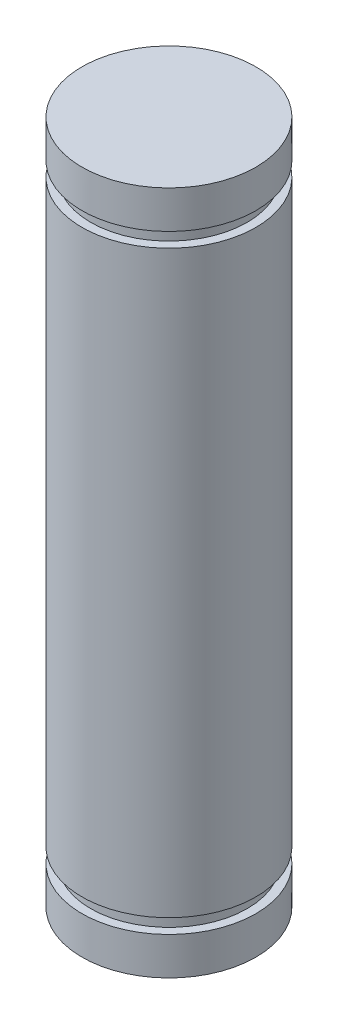
ISO-10303-21;
HEADER;
FILE_DESCRIPTION(('STEP AP214'),'2;1');
FILE_NAME('part.step','',(''),(''),'','','');
FILE_SCHEMA(('AUTOMOTIVE_DESIGN { 1 0 10303 214 1 1 1 1 }'));
ENDSEC;
DATA;
#1=APPLICATION_CONTEXT('core data for automotive mechanical design processes');
#2=APPLICATION_PROTOCOL_DEFINITION('international standard','automotive_design',2000,#1);
#3=PRODUCT_CONTEXT('',#1,'mechanical');
#4=PRODUCT('Part','Part','',(#3));
#5=PRODUCT_RELATED_PRODUCT_CATEGORY('part','',(#4));
#6=PRODUCT_DEFINITION_FORMATION('','',#4);
#7=PRODUCT_DEFINITION_CONTEXT('part definition',#1,'design');
#8=PRODUCT_DEFINITION('design','',#6,#7);
#9=PRODUCT_DEFINITION_SHAPE('','',#8);
#10=(LENGTH_UNIT() NAMED_UNIT(*) SI_UNIT(.MILLI.,.METRE.));
#11=(NAMED_UNIT(*) PLANE_ANGLE_UNIT() SI_UNIT($,.RADIAN.));
#12=(NAMED_UNIT(*) SI_UNIT($,.STERADIAN.) SOLID_ANGLE_UNIT());
#13=UNCERTAINTY_MEASURE_WITH_UNIT(LENGTH_MEASURE(1.E-05),#10,'distance_accuracy_value','');
#14=(GEOMETRIC_REPRESENTATION_CONTEXT(3) GLOBAL_UNCERTAINTY_ASSIGNED_CONTEXT((#13)) GLOBAL_UNIT_ASSIGNED_CONTEXT((#10,
#11,#12)) REPRESENTATION_CONTEXT('',''));
#15=CARTESIAN_POINT('',(0.,0.,0.));
#16=DIRECTION('',(0.,0.,1.));
#17=DIRECTION('',(1.,0.,0.));
#18=AXIS2_PLACEMENT_3D('',#15,#16,#17);
#19=CARTESIAN_POINT('',(0.,-11.8,0.));
#20=DIRECTION('',(0.,-1.,0.));
#21=DIRECTION('',(1.,0.,0.));
#22=AXIS2_PLACEMENT_3D('',#19,#20,#21);
#23=CYLINDRICAL_SURFACE('',#22,3.);
#24=CARTESIAN_POINT('',(0.,11.8,0.));
#25=DIRECTION('',(0.,-1.,0.));
#26=DIRECTION('',(1.,0.,0.));
#27=AXIS2_PLACEMENT_3D('',#24,#25,#26);
#28=CIRCLE('',#27,3.);
#29=CARTESIAN_POINT('',(3.,11.8,0.));
#30=VERTEX_POINT('',#29);
#31=EDGE_CURVE('E42',#30,#30,#28,.T.);
#32=ORIENTED_EDGE('',*,*,#31,.T.);
#33=EDGE_LOOP('',(#32));
#34=FACE_BOUND('',#33,.T.);
#35=CARTESIAN_POINT('',(0.,10.5,0.));
#36=DIRECTION('',(0.,-1.,0.));
#37=DIRECTION('',(0.,0.,-1.));
#38=AXIS2_PLACEMENT_3D('',#35,#36,#37);
#39=CIRCLE('',#38,2.99999999999999);
#40=CARTESIAN_POINT('',(0.,10.5,-2.99999999999999));
#41=VERTEX_POINT('',#40);
#42=EDGE_CURVE('E67',#41,#41,#39,.T.);
#43=ORIENTED_EDGE('',*,*,#42,.F.);
#44=EDGE_LOOP('',(#43));
#45=FACE_BOUND('',#44,.T.);
#46=ADVANCED_FACE('F40',(#34,#45),#23,.T.);
#47=CARTESIAN_POINT('',(-3.,11.8,0.));
#48=DIRECTION('',(0.,-1.,0.));
#49=DIRECTION('',(1.,0.,0.));
#50=AXIS2_PLACEMENT_3D('',#47,#48,#49);
#51=PLANE('',#50);
#52=ORIENTED_EDGE('',*,*,#31,.F.);
#53=EDGE_LOOP('',(#52));
#54=FACE_BOUND('',#53,.T.);
#55=ADVANCED_FACE('F39',(#54),#51,.F.);
#56=CARTESIAN_POINT('',(0.,0.,0.));
#57=DIRECTION('',(0.,-1.,0.));
#58=DIRECTION('',(0.,0.,-1.));
#59=AXIS2_PLACEMENT_3D('',#56,#57,#58);
#60=CYLINDRICAL_SURFACE('',#59,2.7);
#61=CARTESIAN_POINT('',(0.,10.5,0.));
#62=DIRECTION('',(0.,-1.,0.));
#63=DIRECTION('',(0.,0.,-1.));
#64=AXIS2_PLACEMENT_3D('',#61,#62,#63);
#65=CIRCLE('',#64,2.7);
#66=CARTESIAN_POINT('',(0.,10.5,-2.7));
#67=VERTEX_POINT('',#66);
#68=EDGE_CURVE('E59',#67,#67,#65,.T.);
#69=ORIENTED_EDGE('',*,*,#68,.T.);
#70=EDGE_LOOP('',(#69));
#71=FACE_BOUND('',#70,.T.);
#72=CARTESIAN_POINT('',(0.,10.,0.));
#73=DIRECTION('',(0.,-1.,0.));
#74=DIRECTION('',(0.,0.,-1.));
#75=AXIS2_PLACEMENT_3D('',#72,#73,#74);
#76=CIRCLE('',#75,2.7);
#77=CARTESIAN_POINT('',(0.,10.,-2.7));
#78=VERTEX_POINT('',#77);
#79=EDGE_CURVE('E48',#78,#78,#76,.T.);
#80=ORIENTED_EDGE('',*,*,#79,.F.);
#81=EDGE_LOOP('',(#80));
#82=FACE_BOUND('',#81,.T.);
#83=ADVANCED_FACE('F79',(#71,#82),#60,.T.);
#84=CARTESIAN_POINT('',(-2.7,10.,0.));
#85=DIRECTION('',(0.,1.,0.));
#86=DIRECTION('',(0.,0.,1.));
#87=AXIS2_PLACEMENT_3D('',#84,#85,#86);
#88=PLANE('',#87);
#89=ORIENTED_EDGE('',*,*,#79,.T.);
#90=EDGE_LOOP('',(#89));
#91=FACE_BOUND('',#90,.T.);
#92=CARTESIAN_POINT('',(0.,10.,0.));
#93=DIRECTION('',(0.,-1.,0.));
#94=DIRECTION('',(0.,0.,-1.));
#95=AXIS2_PLACEMENT_3D('',#92,#93,#94);
#96=CIRCLE('',#95,2.99999999999999);
#97=CARTESIAN_POINT('',(0.,10.,-2.99999999999999));
#98=VERTEX_POINT('',#97);
#99=EDGE_CURVE('E55',#98,#98,#96,.T.);
#100=ORIENTED_EDGE('',*,*,#99,.F.);
#101=EDGE_LOOP('',(#100));
#102=FACE_BOUND('',#101,.T.);
#103=ADVANCED_FACE('F81',(#91,#102),#88,.T.);
#104=CARTESIAN_POINT('',(-2.99999999999999,10.5,0.));
#105=DIRECTION('',(0.,-1.,0.));
#106=DIRECTION('',(0.,0.,-1.));
#107=AXIS2_PLACEMENT_3D('',#104,#105,#106);
#108=PLANE('',#107);
#109=ORIENTED_EDGE('',*,*,#42,.T.);
#110=EDGE_LOOP('',(#109));
#111=FACE_BOUND('',#110,.T.);
#112=ORIENTED_EDGE('',*,*,#68,.F.);
#113=EDGE_LOOP('',(#112));
#114=FACE_BOUND('',#113,.T.);
#115=ADVANCED_FACE('F78',(#111,#114),#108,.T.);
#116=CARTESIAN_POINT('',(0.,-10.,0.));
#117=DIRECTION('',(0.,-1.,0.));
#118=DIRECTION('',(0.,0.,-1.));
#119=AXIS2_PLACEMENT_3D('',#116,#117,#118);
#120=CIRCLE('',#119,2.99999999999999);
#121=CARTESIAN_POINT('',(0.,-10.,-2.99999999999999));
#122=VERTEX_POINT('',#121);
#123=EDGE_CURVE('E61',#122,#122,#120,.T.);
#124=ORIENTED_EDGE('',*,*,#123,.F.);
#125=EDGE_LOOP('',(#124));
#126=FACE_BOUND('',#125,.T.);
#127=ORIENTED_EDGE('',*,*,#99,.T.);
#128=EDGE_LOOP('',(#127));
#129=FACE_BOUND('',#128,.T.);
#130=ADVANCED_FACE('F84',(#126,#129),#23,.T.);
#131=CARTESIAN_POINT('',(-2.99999999999999,-10.5,0.));
#132=DIRECTION('',(0.,1.,0.));
#133=DIRECTION('',(0.,0.,1.));
#134=AXIS2_PLACEMENT_3D('',#131,#132,#133);
#135=PLANE('',#134);
#136=CARTESIAN_POINT('',(0.,-10.5,0.));
#137=DIRECTION('',(0.,-1.,0.));
#138=DIRECTION('',(0.,0.,-1.));
#139=AXIS2_PLACEMENT_3D('',#136,#137,#138);
#140=CIRCLE('',#139,2.7);
#141=CARTESIAN_POINT('',(0.,-10.5,-2.7));
#142=VERTEX_POINT('',#141);
#143=EDGE_CURVE('E54',#142,#142,#140,.T.);
#144=ORIENTED_EDGE('',*,*,#143,.T.);
#145=EDGE_LOOP('',(#144));
#146=FACE_BOUND('',#145,.T.);
#147=CARTESIAN_POINT('',(0.,-10.5,0.));
#148=DIRECTION('',(0.,-1.,0.));
#149=DIRECTION('',(0.,0.,-1.));
#150=AXIS2_PLACEMENT_3D('',#147,#148,#149);
#151=CIRCLE('',#150,2.99999999999999);
#152=CARTESIAN_POINT('',(0.,-10.5,-2.99999999999999));
#153=VERTEX_POINT('',#152);
#154=EDGE_CURVE('E62',#153,#153,#151,.T.);
#155=ORIENTED_EDGE('',*,*,#154,.F.);
#156=EDGE_LOOP('',(#155));
#157=FACE_BOUND('',#156,.T.);
#158=ADVANCED_FACE('F90',(#146,#157),#135,.T.);
#159=CARTESIAN_POINT('',(0.,0.,0.));
#160=DIRECTION('',(0.,-1.,0.));
#161=DIRECTION('',(0.,0.,-1.));
#162=AXIS2_PLACEMENT_3D('',#159,#160,#161);
#163=CYLINDRICAL_SURFACE('',#162,2.7);
#164=CARTESIAN_POINT('',(0.,-10.,0.));
#165=DIRECTION('',(0.,-1.,0.));
#166=DIRECTION('',(0.,0.,-1.));
#167=AXIS2_PLACEMENT_3D('',#164,#165,#166);
#168=CIRCLE('',#167,2.7);
#169=CARTESIAN_POINT('',(0.,-10.,-2.7));
#170=VERTEX_POINT('',#169);
#171=EDGE_CURVE('E56',#170,#170,#168,.T.);
#172=ORIENTED_EDGE('',*,*,#171,.T.);
#173=EDGE_LOOP('',(#172));
#174=FACE_BOUND('',#173,.T.);
#175=ORIENTED_EDGE('',*,*,#143,.F.);
#176=EDGE_LOOP('',(#175));
#177=FACE_BOUND('',#176,.T.);
#178=ADVANCED_FACE('F113',(#174,#177),#163,.T.);
#179=CARTESIAN_POINT('',(-2.7,-10.,0.));
#180=DIRECTION('',(0.,-1.,0.));
#181=DIRECTION('',(0.,0.,-1.));
#182=AXIS2_PLACEMENT_3D('',#179,#180,#181);
#183=PLANE('',#182);
#184=ORIENTED_EDGE('',*,*,#123,.T.);
#185=EDGE_LOOP('',(#184));
#186=FACE_BOUND('',#185,.T.);
#187=ORIENTED_EDGE('',*,*,#171,.F.);
#188=EDGE_LOOP('',(#187));
#189=FACE_BOUND('',#188,.T.);
#190=ADVANCED_FACE('F109',(#186,#189),#183,.T.);
#191=CARTESIAN_POINT('',(0.,-11.8,0.));
#192=DIRECTION('',(0.,1.,0.));
#193=DIRECTION('',(-1.,0.,0.));
#194=AXIS2_PLACEMENT_3D('',#191,#192,#193);
#195=PLANE('',#194);
#196=CARTESIAN_POINT('',(0.,-11.8,0.));
#197=DIRECTION('',(0.,-1.,0.));
#198=DIRECTION('',(1.,0.,0.));
#199=AXIS2_PLACEMENT_3D('',#196,#197,#198);
#200=CIRCLE('',#199,3.);
#201=CARTESIAN_POINT('',(3.,-11.8,0.));
#202=VERTEX_POINT('',#201);
#203=EDGE_CURVE('E10',#202,#202,#200,.T.);
#204=ORIENTED_EDGE('',*,*,#203,.T.);
#205=EDGE_LOOP('',(#204));
#206=FACE_BOUND('',#205,.T.);
#207=ADVANCED_FACE('F104',(#206),#195,.F.);
#208=ORIENTED_EDGE('',*,*,#203,.F.);
#209=EDGE_LOOP('',(#208));
#210=FACE_BOUND('',#209,.T.);
#211=ORIENTED_EDGE('',*,*,#154,.T.);
#212=EDGE_LOOP('',(#211));
#213=FACE_BOUND('',#212,.T.);
#214=ADVANCED_FACE('F95',(#210,#213),#23,.T.);
#215=CLOSED_SHELL('',(#46,#55,#83,#103,#115,#130,#158,#178,#190,#207,#214));
#216=MANIFOLD_SOLID_BREP('B2',#215);
#217=ADVANCED_BREP_SHAPE_REPRESENTATION('',(#18,#216),#14);
#218=SHAPE_DEFINITION_REPRESENTATION(#9,#217);
ENDSEC;
END-ISO-10303-21;
